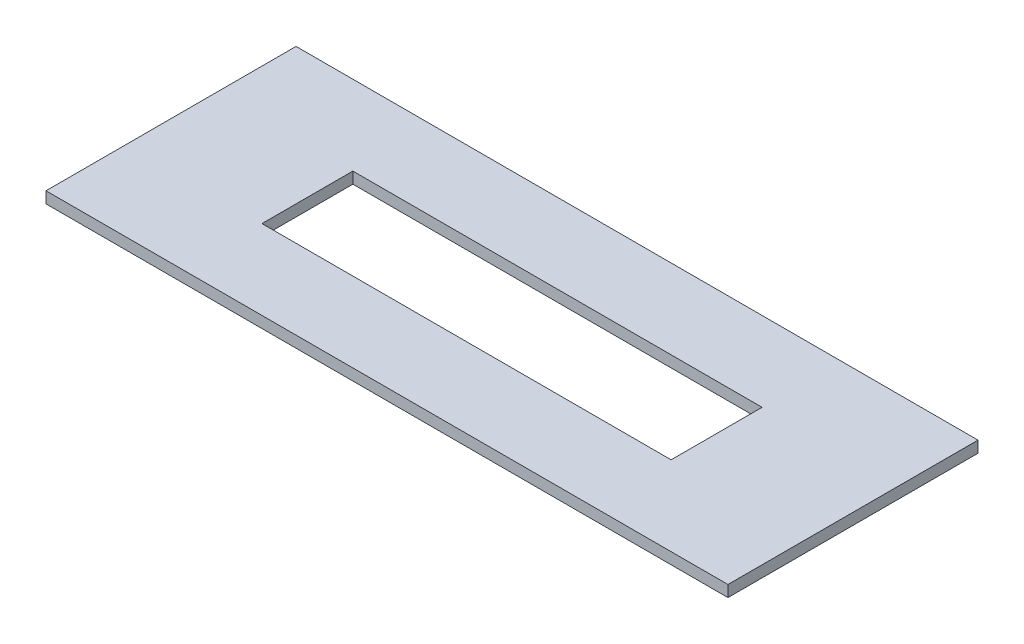
ISO-10303-21;
HEADER;
FILE_DESCRIPTION(('STEP AP214'),'2;1');
FILE_NAME('part.step','',(''),(''),'','','');
FILE_SCHEMA(('AUTOMOTIVE_DESIGN { 1 0 10303 214 1 1 1 1 }'));
ENDSEC;
DATA;
#1=APPLICATION_CONTEXT('core data for automotive mechanical design processes');
#2=APPLICATION_PROTOCOL_DEFINITION('international standard','automotive_design',2000,#1);
#3=PRODUCT_CONTEXT('',#1,'mechanical');
#4=PRODUCT('Part','Part','',(#3));
#5=PRODUCT_RELATED_PRODUCT_CATEGORY('part','',(#4));
#6=PRODUCT_DEFINITION_FORMATION('','',#4);
#7=PRODUCT_DEFINITION_CONTEXT('part definition',#1,'design');
#8=PRODUCT_DEFINITION('design','',#6,#7);
#9=PRODUCT_DEFINITION_SHAPE('','',#8);
#10=(LENGTH_UNIT() NAMED_UNIT(*) SI_UNIT(.MILLI.,.METRE.));
#11=(NAMED_UNIT(*) PLANE_ANGLE_UNIT() SI_UNIT($,.RADIAN.));
#12=(NAMED_UNIT(*) SI_UNIT($,.STERADIAN.) SOLID_ANGLE_UNIT());
#13=UNCERTAINTY_MEASURE_WITH_UNIT(LENGTH_MEASURE(1.E-05),#10,'distance_accuracy_value','');
#14=(GEOMETRIC_REPRESENTATION_CONTEXT(3) GLOBAL_UNCERTAINTY_ASSIGNED_CONTEXT((#13)) GLOBAL_UNIT_ASSIGNED_CONTEXT((#10,
#11,#12)) REPRESENTATION_CONTEXT('',''));
#15=CARTESIAN_POINT('',(0.,0.,0.));
#16=DIRECTION('',(0.,0.,1.));
#17=DIRECTION('',(1.,0.,0.));
#18=AXIS2_PLACEMENT_3D('',#15,#16,#17);
#19=CARTESIAN_POINT('',(0.,0.79375,0.));
#20=DIRECTION('',(0.,1.,0.));
#21=DIRECTION('',(0.,0.,1.));
#22=AXIS2_PLACEMENT_3D('',#19,#20,#21);
#23=PLANE('',#22);
#24=DIRECTION('',(0.,0.,-1.));
#25=VECTOR('',#24,1.);
#26=CARTESIAN_POINT('',(23.8125,0.79375,-8.73125));
#27=LINE('',#26,#25);
#28=CARTESIAN_POINT('',(23.8125,0.79375,8.73125));
#29=VERTEX_POINT('',#28);
#30=CARTESIAN_POINT('',(23.8125,0.79375,-8.73125));
#31=VERTEX_POINT('',#30);
#32=EDGE_CURVE('E134',#29,#31,#27,.T.);
#33=ORIENTED_EDGE('',*,*,#32,.T.);
#34=DIRECTION('',(-1.,0.,0.));
#35=VECTOR('',#34,1.);
#36=CARTESIAN_POINT('',(-23.8125,0.79375,-8.73125));
#37=LINE('',#36,#35);
#38=CARTESIAN_POINT('',(-23.8125,0.79375,-8.73125));
#39=VERTEX_POINT('',#38);
#40=EDGE_CURVE('E137',#31,#39,#37,.T.);
#41=ORIENTED_EDGE('',*,*,#40,.T.);
#42=DIRECTION('',(0.,0.,1.));
#43=VECTOR('',#42,1.);
#44=CARTESIAN_POINT('',(-23.8125,0.79375,-8.73125));
#45=LINE('',#44,#43);
#46=CARTESIAN_POINT('',(-23.8125,0.79375,8.73125));
#47=VERTEX_POINT('',#46);
#48=EDGE_CURVE('E140',#39,#47,#45,.T.);
#49=ORIENTED_EDGE('',*,*,#48,.T.);
#50=DIRECTION('',(1.,0.,0.));
#51=VECTOR('',#50,1.);
#52=CARTESIAN_POINT('',(-23.8125,0.79375,8.73125));
#53=LINE('',#52,#51);
#54=EDGE_CURVE('E142',#47,#29,#53,.T.);
#55=ORIENTED_EDGE('',*,*,#54,.T.);
#56=EDGE_LOOP('',(#33,#41,#49,#55));
#57=FACE_BOUND('',#56,.T.);
#58=DIRECTION('',(-1.,0.,0.));
#59=VECTOR('',#58,1.);
#60=CARTESIAN_POINT('',(-14.2875,0.79375,-3.175));
#61=LINE('',#60,#59);
#62=CARTESIAN_POINT('',(14.2875,0.79375,-3.175));
#63=VERTEX_POINT('',#62);
#64=CARTESIAN_POINT('',(-14.2875,0.79375,-3.175));
#65=VERTEX_POINT('',#64);
#66=EDGE_CURVE('E106',#63,#65,#61,.T.);
#67=ORIENTED_EDGE('',*,*,#66,.F.);
#68=DIRECTION('',(0.,0.,-1.));
#69=VECTOR('',#68,1.);
#70=CARTESIAN_POINT('',(14.2875,0.79375,-3.175));
#71=LINE('',#70,#69);
#72=CARTESIAN_POINT('',(14.2875,0.79375,3.175));
#73=VERTEX_POINT('',#72);
#74=EDGE_CURVE('E98',#73,#63,#71,.T.);
#75=ORIENTED_EDGE('',*,*,#74,.F.);
#76=DIRECTION('',(1.,0.,0.));
#77=VECTOR('',#76,1.);
#78=CARTESIAN_POINT('',(-14.2875,0.79375,3.175));
#79=LINE('',#78,#77);
#80=CARTESIAN_POINT('',(-14.2875,0.79375,3.175));
#81=VERTEX_POINT('',#80);
#82=EDGE_CURVE('E120',#81,#73,#79,.T.);
#83=ORIENTED_EDGE('',*,*,#82,.F.);
#84=DIRECTION('',(0.,0.,1.));
#85=VECTOR('',#84,1.);
#86=CARTESIAN_POINT('',(-14.2875,0.79375,-3.175));
#87=LINE('',#86,#85);
#88=EDGE_CURVE('E118',#65,#81,#87,.T.);
#89=ORIENTED_EDGE('',*,*,#88,.F.);
#90=EDGE_LOOP('',(#67,#75,#83,#89));
#91=FACE_BOUND('',#90,.T.);
#92=ADVANCED_FACE('F33',(#57,#91),#23,.T.);
#93=CARTESIAN_POINT('',(0.,0.,0.));
#94=DIRECTION('',(0.,1.,0.));
#95=DIRECTION('',(0.,0.,1.));
#96=AXIS2_PLACEMENT_3D('',#93,#94,#95);
#97=PLANE('',#96);
#98=DIRECTION('',(0.,0.,-1.));
#99=VECTOR('',#98,1.);
#100=CARTESIAN_POINT('',(23.8125,0.,-8.73125));
#101=LINE('',#100,#99);
#102=CARTESIAN_POINT('',(23.8125,0.,8.73125));
#103=VERTEX_POINT('',#102);
#104=CARTESIAN_POINT('',(23.8125,0.,-8.73125));
#105=VERTEX_POINT('',#104);
#106=EDGE_CURVE('E114',#103,#105,#101,.T.);
#107=ORIENTED_EDGE('',*,*,#106,.F.);
#108=DIRECTION('',(1.,0.,0.));
#109=VECTOR('',#108,1.);
#110=CARTESIAN_POINT('',(-23.8125,0.,8.73125));
#111=LINE('',#110,#109);
#112=CARTESIAN_POINT('',(-23.8125,0.,8.73125));
#113=VERTEX_POINT('',#112);
#114=EDGE_CURVE('E138',#113,#103,#111,.T.);
#115=ORIENTED_EDGE('',*,*,#114,.F.);
#116=DIRECTION('',(0.,0.,1.));
#117=VECTOR('',#116,1.);
#118=CARTESIAN_POINT('',(-23.8125,0.,-8.73125));
#119=LINE('',#118,#117);
#120=CARTESIAN_POINT('',(-23.8125,0.,-8.73125));
#121=VERTEX_POINT('',#120);
#122=EDGE_CURVE('E149',#121,#113,#119,.T.);
#123=ORIENTED_EDGE('',*,*,#122,.F.);
#124=DIRECTION('',(-1.,0.,0.));
#125=VECTOR('',#124,1.);
#126=CARTESIAN_POINT('',(-23.8125,0.,-8.73125));
#127=LINE('',#126,#125);
#128=EDGE_CURVE('E147',#105,#121,#127,.T.);
#129=ORIENTED_EDGE('',*,*,#128,.F.);
#130=EDGE_LOOP('',(#107,#115,#123,#129));
#131=FACE_BOUND('',#130,.T.);
#132=DIRECTION('',(0.,0.,-1.));
#133=VECTOR('',#132,1.);
#134=CARTESIAN_POINT('',(14.2875,0.,-3.175));
#135=LINE('',#134,#133);
#136=CARTESIAN_POINT('',(14.2875,0.,3.175));
#137=VERTEX_POINT('',#136);
#138=CARTESIAN_POINT('',(14.2875,0.,-3.175));
#139=VERTEX_POINT('',#138);
#140=EDGE_CURVE('E56',#137,#139,#135,.T.);
#141=ORIENTED_EDGE('',*,*,#140,.T.);
#142=DIRECTION('',(-1.,0.,0.));
#143=VECTOR('',#142,1.);
#144=CARTESIAN_POINT('',(-14.2875,0.,-3.175));
#145=LINE('',#144,#143);
#146=CARTESIAN_POINT('',(-14.2875,0.,-3.175));
#147=VERTEX_POINT('',#146);
#148=EDGE_CURVE('E113',#139,#147,#145,.T.);
#149=ORIENTED_EDGE('',*,*,#148,.T.);
#150=DIRECTION('',(0.,0.,1.));
#151=VECTOR('',#150,1.);
#152=CARTESIAN_POINT('',(-14.2875,0.,-3.175));
#153=LINE('',#152,#151);
#154=CARTESIAN_POINT('',(-14.2875,0.,3.175));
#155=VERTEX_POINT('',#154);
#156=EDGE_CURVE('E126',#147,#155,#153,.T.);
#157=ORIENTED_EDGE('',*,*,#156,.T.);
#158=DIRECTION('',(1.,0.,0.));
#159=VECTOR('',#158,1.);
#160=CARTESIAN_POINT('',(-14.2875,0.,3.175));
#161=LINE('',#160,#159);
#162=EDGE_CURVE('E107',#155,#137,#161,.T.);
#163=ORIENTED_EDGE('',*,*,#162,.T.);
#164=EDGE_LOOP('',(#141,#149,#157,#163));
#165=FACE_BOUND('',#164,.T.);
#166=ADVANCED_FACE('F167',(#131,#165),#97,.F.);
#167=CARTESIAN_POINT('',(23.8125,0.79375,-8.73125));
#168=DIRECTION('',(-1.,0.,0.));
#169=DIRECTION('',(0.,0.,1.));
#170=AXIS2_PLACEMENT_3D('',#167,#168,#169);
#171=PLANE('',#170);
#172=ORIENTED_EDGE('',*,*,#106,.T.);
#173=DIRECTION('',(0.,-1.,0.));
#174=VECTOR('',#173,1.);
#175=CARTESIAN_POINT('',(23.8125,0.79375,-8.73125));
#176=LINE('',#175,#174);
#177=EDGE_CURVE('E11',#31,#105,#176,.T.);
#178=ORIENTED_EDGE('',*,*,#177,.F.);
#179=ORIENTED_EDGE('',*,*,#32,.F.);
#180=DIRECTION('',(0.,-1.,0.));
#181=VECTOR('',#180,1.);
#182=CARTESIAN_POINT('',(23.8125,0.79375,8.73125));
#183=LINE('',#182,#181);
#184=EDGE_CURVE('E144',#29,#103,#183,.T.);
#185=ORIENTED_EDGE('',*,*,#184,.T.);
#186=EDGE_LOOP('',(#172,#178,#179,#185));
#187=FACE_BOUND('',#186,.T.);
#188=ADVANCED_FACE('F35',(#187),#171,.F.);
#189=CARTESIAN_POINT('',(-23.8125,0.79375,-8.73125));
#190=DIRECTION('',(0.,0.,1.));
#191=DIRECTION('',(1.,0.,0.));
#192=AXIS2_PLACEMENT_3D('',#189,#190,#191);
#193=PLANE('',#192);
#194=ORIENTED_EDGE('',*,*,#128,.T.);
#195=DIRECTION('',(0.,-1.,0.));
#196=VECTOR('',#195,1.);
#197=CARTESIAN_POINT('',(-23.8125,0.79375,-8.73125));
#198=LINE('',#197,#196);
#199=EDGE_CURVE('E41',#39,#121,#198,.T.);
#200=ORIENTED_EDGE('',*,*,#199,.F.);
#201=ORIENTED_EDGE('',*,*,#40,.F.);
#202=ORIENTED_EDGE('',*,*,#177,.T.);
#203=EDGE_LOOP('',(#194,#200,#201,#202));
#204=FACE_BOUND('',#203,.T.);
#205=ADVANCED_FACE('F177',(#204),#193,.F.);
#206=CARTESIAN_POINT('',(-23.8125,0.79375,-8.73125));
#207=DIRECTION('',(1.,0.,0.));
#208=DIRECTION('',(0.,0.,-1.));
#209=AXIS2_PLACEMENT_3D('',#206,#207,#208);
#210=PLANE('',#209);
#211=ORIENTED_EDGE('',*,*,#122,.T.);
#212=DIRECTION('',(0.,-1.,0.));
#213=VECTOR('',#212,1.);
#214=CARTESIAN_POINT('',(-23.8125,0.79375,8.73125));
#215=LINE('',#214,#213);
#216=EDGE_CURVE('E154',#47,#113,#215,.T.);
#217=ORIENTED_EDGE('',*,*,#216,.F.);
#218=ORIENTED_EDGE('',*,*,#48,.F.);
#219=ORIENTED_EDGE('',*,*,#199,.T.);
#220=EDGE_LOOP('',(#211,#217,#218,#219));
#221=FACE_BOUND('',#220,.T.);
#222=ADVANCED_FACE('F161',(#221),#210,.F.);
#223=CARTESIAN_POINT('',(-23.8125,0.79375,8.73125));
#224=DIRECTION('',(0.,0.,-1.));
#225=DIRECTION('',(-1.,0.,0.));
#226=AXIS2_PLACEMENT_3D('',#223,#224,#225);
#227=PLANE('',#226);
#228=ORIENTED_EDGE('',*,*,#114,.T.);
#229=ORIENTED_EDGE('',*,*,#184,.F.);
#230=ORIENTED_EDGE('',*,*,#54,.F.);
#231=ORIENTED_EDGE('',*,*,#216,.T.);
#232=EDGE_LOOP('',(#228,#229,#230,#231));
#233=FACE_BOUND('',#232,.T.);
#234=ADVANCED_FACE('F171',(#233),#227,.F.);
#235=CARTESIAN_POINT('',(14.2875,0.79375,-3.175));
#236=DIRECTION('',(-1.,0.,0.));
#237=DIRECTION('',(0.,0.,1.));
#238=AXIS2_PLACEMENT_3D('',#235,#236,#237);
#239=PLANE('',#238);
#240=ORIENTED_EDGE('',*,*,#140,.F.);
#241=DIRECTION('',(0.,-1.,0.));
#242=VECTOR('',#241,1.);
#243=CARTESIAN_POINT('',(14.2875,0.79375,3.175));
#244=LINE('',#243,#242);
#245=EDGE_CURVE('E102',#73,#137,#244,.T.);
#246=ORIENTED_EDGE('',*,*,#245,.F.);
#247=ORIENTED_EDGE('',*,*,#74,.T.);
#248=DIRECTION('',(0.,-1.,0.));
#249=VECTOR('',#248,1.);
#250=CARTESIAN_POINT('',(14.2875,0.79375,-3.175));
#251=LINE('',#250,#249);
#252=EDGE_CURVE('E101',#63,#139,#251,.T.);
#253=ORIENTED_EDGE('',*,*,#252,.T.);
#254=EDGE_LOOP('',(#240,#246,#247,#253));
#255=FACE_BOUND('',#254,.T.);
#256=ADVANCED_FACE('F100',(#255),#239,.T.);
#257=CARTESIAN_POINT('',(-14.2875,0.79375,-3.175));
#258=DIRECTION('',(0.,0.,1.));
#259=DIRECTION('',(1.,0.,0.));
#260=AXIS2_PLACEMENT_3D('',#257,#258,#259);
#261=PLANE('',#260);
#262=ORIENTED_EDGE('',*,*,#148,.F.);
#263=ORIENTED_EDGE('',*,*,#252,.F.);
#264=ORIENTED_EDGE('',*,*,#66,.T.);
#265=DIRECTION('',(0.,-1.,0.));
#266=VECTOR('',#265,1.);
#267=CARTESIAN_POINT('',(-14.2875,0.79375,-3.175));
#268=LINE('',#267,#266);
#269=EDGE_CURVE('E115',#65,#147,#268,.T.);
#270=ORIENTED_EDGE('',*,*,#269,.T.);
#271=EDGE_LOOP('',(#262,#263,#264,#270));
#272=FACE_BOUND('',#271,.T.);
#273=ADVANCED_FACE('F110',(#272),#261,.T.);
#274=CARTESIAN_POINT('',(-14.2875,0.79375,-3.175));
#275=DIRECTION('',(1.,0.,0.));
#276=DIRECTION('',(0.,0.,-1.));
#277=AXIS2_PLACEMENT_3D('',#274,#275,#276);
#278=PLANE('',#277);
#279=ORIENTED_EDGE('',*,*,#156,.F.);
#280=ORIENTED_EDGE('',*,*,#269,.F.);
#281=ORIENTED_EDGE('',*,*,#88,.T.);
#282=DIRECTION('',(0.,-1.,0.));
#283=VECTOR('',#282,1.);
#284=CARTESIAN_POINT('',(-14.2875,0.79375,3.175));
#285=LINE('',#284,#283);
#286=EDGE_CURVE('E48',#81,#155,#285,.T.);
#287=ORIENTED_EDGE('',*,*,#286,.T.);
#288=EDGE_LOOP('',(#279,#280,#281,#287));
#289=FACE_BOUND('',#288,.T.);
#290=ADVANCED_FACE('F200',(#289),#278,.T.);
#291=CARTESIAN_POINT('',(-14.2875,0.79375,3.175));
#292=DIRECTION('',(0.,0.,-1.));
#293=DIRECTION('',(-1.,0.,0.));
#294=AXIS2_PLACEMENT_3D('',#291,#292,#293);
#295=PLANE('',#294);
#296=ORIENTED_EDGE('',*,*,#162,.F.);
#297=ORIENTED_EDGE('',*,*,#286,.F.);
#298=ORIENTED_EDGE('',*,*,#82,.T.);
#299=ORIENTED_EDGE('',*,*,#245,.T.);
#300=EDGE_LOOP('',(#296,#297,#298,#299));
#301=FACE_BOUND('',#300,.T.);
#302=ADVANCED_FACE('F204',(#301),#295,.T.);
#303=CLOSED_SHELL('',(#92,#166,#188,#205,#222,#234,#256,#273,#290,#302));
#304=MANIFOLD_SOLID_BREP('B2',#303);
#305=ADVANCED_BREP_SHAPE_REPRESENTATION('',(#18,#304),#14);
#306=SHAPE_DEFINITION_REPRESENTATION(#9,#305);
ENDSEC;
END-ISO-10303-21;
